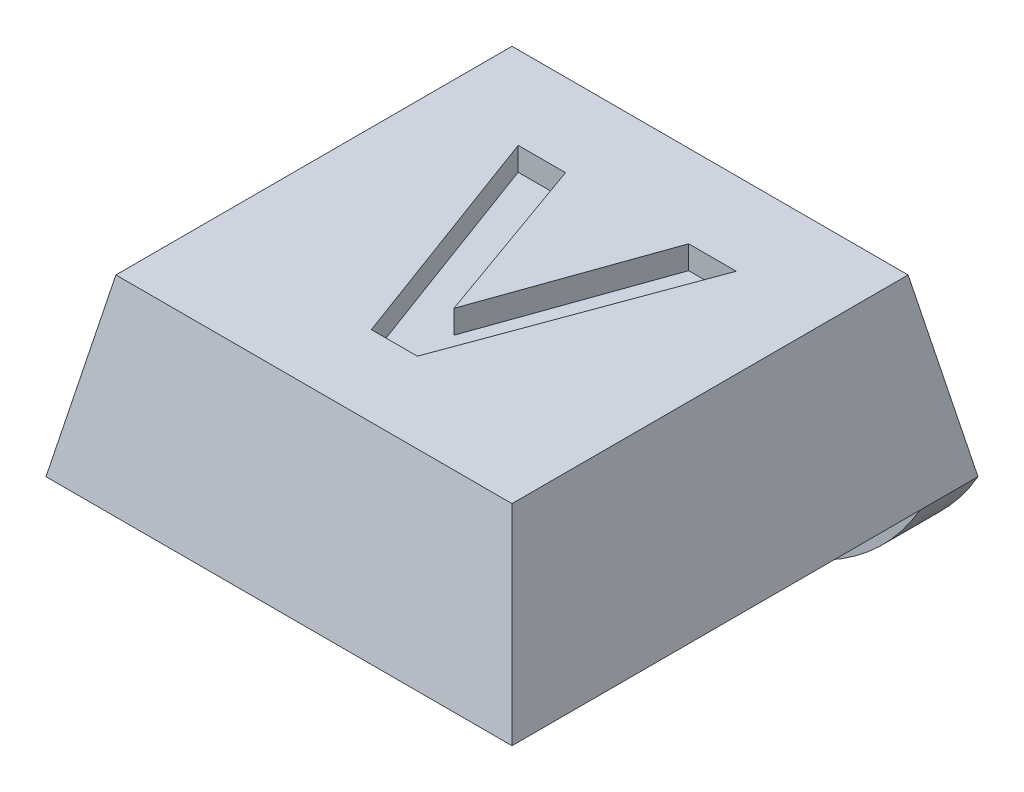
ISO-10303-21;
HEADER;
FILE_DESCRIPTION(('STEP AP214'),'2;1');
FILE_NAME('part.step','',(''),(''),'','','');
FILE_SCHEMA(('AUTOMOTIVE_DESIGN { 1 0 10303 214 1 1 1 1 }'));
ENDSEC;
DATA;
#1=APPLICATION_CONTEXT('core data for automotive mechanical design processes');
#2=APPLICATION_PROTOCOL_DEFINITION('international standard','automotive_design',2000,#1);
#3=PRODUCT_CONTEXT('',#1,'mechanical');
#4=PRODUCT('Part','Part','',(#3));
#5=PRODUCT_RELATED_PRODUCT_CATEGORY('part','',(#4));
#6=PRODUCT_DEFINITION_FORMATION('','',#4);
#7=PRODUCT_DEFINITION_CONTEXT('part definition',#1,'design');
#8=PRODUCT_DEFINITION('design','',#6,#7);
#9=PRODUCT_DEFINITION_SHAPE('','',#8);
#10=(LENGTH_UNIT() NAMED_UNIT(*) SI_UNIT(.MILLI.,.METRE.));
#11=(NAMED_UNIT(*) PLANE_ANGLE_UNIT() SI_UNIT($,.RADIAN.));
#12=(NAMED_UNIT(*) SI_UNIT($,.STERADIAN.) SOLID_ANGLE_UNIT());
#13=UNCERTAINTY_MEASURE_WITH_UNIT(LENGTH_MEASURE(1.E-05),#10,'distance_accuracy_value','');
#14=(GEOMETRIC_REPRESENTATION_CONTEXT(3) GLOBAL_UNCERTAINTY_ASSIGNED_CONTEXT((#13)) GLOBAL_UNIT_ASSIGNED_CONTEXT((#10,
#11,#12)) REPRESENTATION_CONTEXT('',''));
#15=CARTESIAN_POINT('',(0.,0.,0.));
#16=DIRECTION('',(0.,0.,1.));
#17=DIRECTION('',(1.,0.,0.));
#18=AXIS2_PLACEMENT_3D('',#15,#16,#17);
#19=CARTESIAN_POINT('',(0.,3.,0.));
#20=DIRECTION('',(0.,-1.,0.));
#21=DIRECTION('',(0.,0.,-1.));
#22=AXIS2_PLACEMENT_3D('',#19,#20,#21);
#23=PLANE('',#22);
#24=DIRECTION('',(-1.,0.,0.));
#25=VECTOR('',#24,1.);
#26=CARTESIAN_POINT('',(11.,3.,-0.6));
#27=LINE('',#26,#25);
#28=CARTESIAN_POINT('',(7.4,3.,-0.6));
#29=VERTEX_POINT('',#28);
#30=CARTESIAN_POINT('',(0.6,3.,-0.6));
#31=VERTEX_POINT('',#30);
#32=EDGE_CURVE('E199',#29,#31,#27,.T.);
#33=ORIENTED_EDGE('',*,*,#32,.F.);
#34=DIRECTION('',(0.,0.,1.));
#35=VECTOR('',#34,1.);
#36=CARTESIAN_POINT('',(7.4,3.,-8.));
#37=LINE('',#36,#35);
#38=CARTESIAN_POINT('',(7.4,3.,-7.4));
#39=VERTEX_POINT('',#38);
#40=EDGE_CURVE('E212',#39,#29,#37,.T.);
#41=ORIENTED_EDGE('',*,*,#40,.F.);
#42=DIRECTION('',(-1.,0.,0.));
#43=VECTOR('',#42,1.);
#44=CARTESIAN_POINT('',(11.,3.,-7.4));
#45=LINE('',#44,#43);
#46=CARTESIAN_POINT('',(0.599999999999999,3.,-7.4));
#47=VERTEX_POINT('',#46);
#48=EDGE_CURVE('E195',#39,#47,#45,.T.);
#49=ORIENTED_EDGE('',*,*,#48,.T.);
#50=DIRECTION('',(0.,0.,1.));
#51=VECTOR('',#50,1.);
#52=CARTESIAN_POINT('',(0.6,3.,-8.));
#53=LINE('',#52,#51);
#54=EDGE_CURVE('E215',#47,#31,#53,.T.);
#55=ORIENTED_EDGE('',*,*,#54,.T.);
#56=EDGE_LOOP('',(#33,#41,#49,#55));
#57=FACE_BOUND('',#56,.T.);
#58=DIRECTION('',(-1.,0.,0.));
#59=VECTOR('',#58,1.);
#60=CARTESIAN_POINT('',(4.39628987339704,3.,-1.97972373207462));
#61=LINE('',#60,#59);
#62=CARTESIAN_POINT('',(4.39628987339704,3.,-1.97972373207462));
#63=VERTEX_POINT('',#62);
#64=CARTESIAN_POINT('',(3.60542448878166,3.,-1.97972373207462));
#65=VERTEX_POINT('',#64);
#66=EDGE_CURVE('E58',#63,#65,#61,.T.);
#67=ORIENTED_EDGE('',*,*,#66,.T.);
#68=DIRECTION('',(-0.346837004095032,0.,-0.937925419524593));
#69=VECTOR('',#68,1.);
#70=CARTESIAN_POINT('',(3.60542448878166,3.,-1.97972373207462));
#71=LINE('',#70,#69);
#72=CARTESIAN_POINT('',(2.12625782211499,3.,-5.97972373207462));
#73=VERTEX_POINT('',#72);
#74=EDGE_CURVE('E167',#65,#73,#71,.T.);
#75=ORIENTED_EDGE('',*,*,#74,.T.);
#76=DIRECTION('',(1.,0.,0.));
#77=VECTOR('',#76,1.);
#78=CARTESIAN_POINT('',(2.12625782211499,3.,-5.97972373207462));
#79=LINE('',#78,#77);
#80=CARTESIAN_POINT('',(2.93875782211499,3.,-5.97972373207462));
#81=VERTEX_POINT('',#80);
#82=EDGE_CURVE('E561',#73,#81,#79,.T.);
#83=ORIENTED_EDGE('',*,*,#82,.T.);
#84=DIRECTION('',(0.335500275538548,0.,0.942040108017466));
#85=VECTOR('',#84,1.);
#86=CARTESIAN_POINT('',(2.93875782211499,3.,-5.97972373207462));
#87=LINE('',#86,#85);
#88=CARTESIAN_POINT('',(3.99805269390987,3.,-3.00536475771565));
#89=VERTEX_POINT('',#88);
#90=EDGE_CURVE('E542',#81,#89,#87,.T.);
#91=ORIENTED_EDGE('',*,*,#90,.T.);
#92=DIRECTION('',(0.33437347432051,0.,-0.942440650476639));
#93=VECTOR('',#92,1.);
#94=CARTESIAN_POINT('',(3.99805269390987,3.,-3.00536475771565));
#95=LINE('',#94,#93);
#96=CARTESIAN_POINT('',(5.05334115544833,3.,-5.97972373207462));
#97=VERTEX_POINT('',#96);
#98=EDGE_CURVE('E537',#89,#97,#95,.T.);
#99=ORIENTED_EDGE('',*,*,#98,.T.);
#100=DIRECTION('',(1.,0.,0.));
#101=VECTOR('',#100,1.);
#102=CARTESIAN_POINT('',(5.05334115544833,3.,-5.97972373207462));
#103=LINE('',#102,#101);
#104=CARTESIAN_POINT('',(5.86984756570474,3.,-5.97972373207462));
#105=VERTEX_POINT('',#104);
#106=EDGE_CURVE('E531',#97,#105,#103,.T.);
#107=ORIENTED_EDGE('',*,*,#106,.T.);
#108=DIRECTION('',(-0.345679226097517,0.,0.93835274425166));
#109=VECTOR('',#108,1.);
#110=CARTESIAN_POINT('',(5.86984756570474,3.,-5.97972373207462));
#111=LINE('',#110,#109);
#112=EDGE_CURVE('E163',#105,#63,#111,.T.);
#113=ORIENTED_EDGE('',*,*,#112,.T.);
#114=EDGE_LOOP('',(#67,#75,#83,#91,#99,#107,#113));
#115=FACE_BOUND('',#114,.T.);
#116=ADVANCED_FACE('F42',(#57,#115),#23,.F.);
#117=CARTESIAN_POINT('',(8.,0.,-8.));
#118=DIRECTION('',(-0.98058067569092,-0.196116135138184,0.));
#119=DIRECTION('',(0.196116135138184,-0.98058067569092,0.));
#120=AXIS2_PLACEMENT_3D('',#117,#118,#119);
#121=PLANE('',#120);
#122=DIRECTION('',(-0.192450089729875,0.962250448649376,-0.192450089729875));
#123=VECTOR('',#122,1.);
#124=CARTESIAN_POINT('',(7.7037037037037,1.48148148148148,-0.296296296296296));
#125=LINE('',#124,#123);
#126=CARTESIAN_POINT('',(8.,0.,0.));
#127=VERTEX_POINT('',#126);
#128=EDGE_CURVE('E209',#127,#29,#125,.T.);
#129=ORIENTED_EDGE('',*,*,#128,.F.);
#130=DIRECTION('',(0.,0.,-1.));
#131=VECTOR('',#130,1.);
#132=CARTESIAN_POINT('',(8.,0.,0.));
#133=LINE('',#132,#131);
#134=CARTESIAN_POINT('',(8.,0.,-7.));
#135=VERTEX_POINT('',#134);
#136=EDGE_CURVE('E228',#127,#135,#133,.T.);
#137=ORIENTED_EDGE('',*,*,#136,.T.);
#138=DIRECTION('',(0.,0.,1.));
#139=VECTOR('',#138,1.);
#140=CARTESIAN_POINT('',(8.,0.,-8.));
#141=LINE('',#140,#139);
#142=CARTESIAN_POINT('',(8.,0.,-8.));
#143=VERTEX_POINT('',#142);
#144=EDGE_CURVE('E169',#143,#135,#141,.T.);
#145=ORIENTED_EDGE('',*,*,#144,.F.);
#146=DIRECTION('',(0.192450089729875,-0.962250448649376,-0.192450089729875));
#147=VECTOR('',#146,1.);
#148=CARTESIAN_POINT('',(8.,0.,-8.));
#149=LINE('',#148,#147);
#150=EDGE_CURVE('E202',#39,#143,#149,.T.);
#151=ORIENTED_EDGE('',*,*,#150,.F.);
#152=ORIENTED_EDGE('',*,*,#40,.T.);
#153=EDGE_LOOP('',(#129,#137,#145,#151,#152));
#154=FACE_BOUND('',#153,.T.);
#155=ADVANCED_FACE('F296',(#154),#121,.F.);
#156=CARTESIAN_POINT('',(0.,0.,-8.));
#157=DIRECTION('',(0.98058067569092,-0.196116135138184,0.));
#158=DIRECTION('',(0.196116135138184,0.98058067569092,0.));
#159=AXIS2_PLACEMENT_3D('',#156,#157,#158);
#160=PLANE('',#159);
#161=DIRECTION('',(-0.192450089729875,-0.962250448649376,0.192450089729875));
#162=VECTOR('',#161,1.);
#163=CARTESIAN_POINT('',(0.296296296296296,1.48148148148148,-0.296296296296296));
#164=LINE('',#163,#162);
#165=CARTESIAN_POINT('',(0.,0.,0.));
#166=VERTEX_POINT('',#165);
#167=EDGE_CURVE('E256',#31,#166,#164,.T.);
#168=ORIENTED_EDGE('',*,*,#167,.F.);
#169=ORIENTED_EDGE('',*,*,#54,.F.);
#170=DIRECTION('',(0.192450089729875,0.962250448649376,0.192450089729875));
#171=VECTOR('',#170,1.);
#172=CARTESIAN_POINT('',(0.,0.,-8.));
#173=LINE('',#172,#171);
#174=CARTESIAN_POINT('',(0.,0.,-8.));
#175=VERTEX_POINT('',#174);
#176=EDGE_CURVE('E227',#175,#47,#173,.T.);
#177=ORIENTED_EDGE('',*,*,#176,.F.);
#178=DIRECTION('',(0.,0.,1.));
#179=VECTOR('',#178,1.);
#180=CARTESIAN_POINT('',(0.,0.,0.));
#181=LINE('',#180,#179);
#182=CARTESIAN_POINT('',(0.,0.,-7.));
#183=VERTEX_POINT('',#182);
#184=EDGE_CURVE('E232',#175,#183,#181,.T.);
#185=ORIENTED_EDGE('',*,*,#184,.T.);
#186=EDGE_CURVE('E219',#183,#166,#181,.T.);
#187=ORIENTED_EDGE('',*,*,#186,.T.);
#188=EDGE_LOOP('',(#168,#169,#177,#185,#187));
#189=FACE_BOUND('',#188,.T.);
#190=ADVANCED_FACE('F280',(#189),#160,.F.);
#191=CARTESIAN_POINT('',(0.,0.,0.));
#192=DIRECTION('',(0.,-1.,0.));
#193=DIRECTION('',(0.,0.,-1.));
#194=AXIS2_PLACEMENT_3D('',#191,#192,#193);
#195=PLANE('',#194);
#196=DIRECTION('',(-1.,0.,0.));
#197=VECTOR('',#196,1.);
#198=CARTESIAN_POINT('',(0.,0.,-7.));
#199=LINE('',#198,#197);
#200=EDGE_CURVE('E175',#135,#183,#199,.T.);
#201=ORIENTED_EDGE('',*,*,#200,.F.);
#202=ORIENTED_EDGE('',*,*,#136,.F.);
#203=DIRECTION('',(1.,0.,0.));
#204=VECTOR('',#203,1.);
#205=CARTESIAN_POINT('',(0.,0.,0.));
#206=LINE('',#205,#204);
#207=EDGE_CURVE('E229',#166,#127,#206,.T.);
#208=ORIENTED_EDGE('',*,*,#207,.F.);
#209=ORIENTED_EDGE('',*,*,#186,.F.);
#210=EDGE_LOOP('',(#201,#202,#208,#209));
#211=FACE_BOUND('',#210,.T.);
#212=CARTESIAN_POINT('',(4.,0.,-3.75));
#213=DIRECTION('',(0.,-1.,0.));
#214=DIRECTION('',(0.,0.,-1.));
#215=AXIS2_PLACEMENT_3D('',#212,#213,#214);
#216=CIRCLE('',#215,1.8);
#217=CARTESIAN_POINT('',(4.,0.,-5.55));
#218=VERTEX_POINT('',#217);
#219=EDGE_CURVE('E187',#218,#218,#216,.T.);
#220=ORIENTED_EDGE('',*,*,#219,.F.);
#221=EDGE_LOOP('',(#220));
#222=FACE_BOUND('',#221,.T.);
#223=ADVANCED_FACE('F291',(#211,#222),#195,.T.);
#224=CARTESIAN_POINT('',(11.,3.,-7.4));
#225=DIRECTION('',(0.,0.196116135138184,-0.98058067569092));
#226=DIRECTION('',(0.,0.98058067569092,0.196116135138184));
#227=AXIS2_PLACEMENT_3D('',#224,#225,#226);
#228=PLANE('',#227);
#229=ORIENTED_EDGE('',*,*,#150,.T.);
#230=DIRECTION('',(-1.,0.,0.));
#231=VECTOR('',#230,1.);
#232=CARTESIAN_POINT('',(0.,0.,-8.));
#233=LINE('',#232,#231);
#234=EDGE_CURVE('E223',#143,#175,#233,.T.);
#235=ORIENTED_EDGE('',*,*,#234,.T.);
#236=ORIENTED_EDGE('',*,*,#176,.T.);
#237=ORIENTED_EDGE('',*,*,#48,.F.);
#238=EDGE_LOOP('',(#229,#235,#236,#237));
#239=FACE_BOUND('',#238,.T.);
#240=ADVANCED_FACE('F275',(#239),#228,.T.);
#241=CARTESIAN_POINT('',(11.,0.,0.));
#242=DIRECTION('',(0.,0.196116135138184,0.98058067569092));
#243=DIRECTION('',(0.,-0.98058067569092,0.196116135138184));
#244=AXIS2_PLACEMENT_3D('',#241,#242,#243);
#245=PLANE('',#244);
#246=ORIENTED_EDGE('',*,*,#128,.T.);
#247=ORIENTED_EDGE('',*,*,#32,.T.);
#248=ORIENTED_EDGE('',*,*,#167,.T.);
#249=ORIENTED_EDGE('',*,*,#207,.T.);
#250=EDGE_LOOP('',(#246,#247,#248,#249));
#251=FACE_BOUND('',#250,.T.);
#252=ADVANCED_FACE('F322',(#251),#245,.T.);
#253=CARTESIAN_POINT('',(4.,0.8,-3.75));
#254=DIRECTION('',(0.,-1.,0.));
#255=DIRECTION('',(0.,0.,-1.));
#256=AXIS2_PLACEMENT_3D('',#253,#254,#255);
#257=CYLINDRICAL_SURFACE('',#256,1.8);
#258=CARTESIAN_POINT('',(4.,0.8,-3.75));
#259=DIRECTION('',(0.,-1.,0.));
#260=DIRECTION('',(0.,0.,-1.));
#261=AXIS2_PLACEMENT_3D('',#258,#259,#260);
#262=CIRCLE('',#261,1.8);
#263=CARTESIAN_POINT('',(4.,0.8,-5.55));
#264=VERTEX_POINT('',#263);
#265=EDGE_CURVE('E191',#264,#264,#262,.T.);
#266=ORIENTED_EDGE('',*,*,#265,.F.);
#267=EDGE_LOOP('',(#266));
#268=FACE_BOUND('',#267,.T.);
#269=ORIENTED_EDGE('',*,*,#219,.T.);
#270=EDGE_LOOP('',(#269));
#271=FACE_BOUND('',#270,.T.);
#272=ADVANCED_FACE('F329',(#268,#271),#257,.F.);
#273=CARTESIAN_POINT('',(4.,0.8,-3.75));
#274=DIRECTION('',(0.,-1.,0.));
#275=DIRECTION('',(0.,0.,-1.));
#276=AXIS2_PLACEMENT_3D('',#273,#274,#275);
#277=PLANE('',#276);
#278=ORIENTED_EDGE('',*,*,#265,.T.);
#279=EDGE_LOOP('',(#278));
#280=FACE_BOUND('',#279,.T.);
#281=ADVANCED_FACE('F333',(#280),#277,.T.);
#282=CARTESIAN_POINT('',(0.,-2.,-8.));
#283=DIRECTION('',(0.,0.,1.));
#284=DIRECTION('',(1.,0.,0.));
#285=AXIS2_PLACEMENT_3D('',#282,#283,#284);
#286=PLANE('',#285);
#287=ORIENTED_EDGE('',*,*,#234,.F.);
#288=CARTESIAN_POINT('',(4.53589838486225,2.,-8.));
#289=DIRECTION('',(0.,0.,1.));
#290=DIRECTION('',(1.,0.,0.));
#291=AXIS2_PLACEMENT_3D('',#288,#289,#290);
#292=CIRCLE('',#291,4.);
#293=CARTESIAN_POINT('',(4.53589838486225,-2.,-8.));
#294=VERTEX_POINT('',#293);
#295=EDGE_CURVE('E11',#143,#294,#292,.F.);
#296=ORIENTED_EDGE('',*,*,#295,.T.);
#297=DIRECTION('',(1.,0.,0.));
#298=VECTOR('',#297,1.);
#299=CARTESIAN_POINT('',(0.,-2.,-8.));
#300=LINE('',#299,#298);
#301=CARTESIAN_POINT('',(3.46410161513775,-2.,-8.));
#302=VERTEX_POINT('',#301);
#303=EDGE_CURVE('E181',#302,#294,#300,.T.);
#304=ORIENTED_EDGE('',*,*,#303,.F.);
#305=CARTESIAN_POINT('',(3.46410161513775,2.,-8.));
#306=DIRECTION('',(0.,0.,1.));
#307=DIRECTION('',(1.,0.,0.));
#308=AXIS2_PLACEMENT_3D('',#305,#306,#307);
#309=CIRCLE('',#308,4.);
#310=EDGE_CURVE('E51',#302,#175,#309,.F.);
#311=ORIENTED_EDGE('',*,*,#310,.T.);
#312=EDGE_LOOP('',(#287,#296,#304,#311));
#313=FACE_BOUND('',#312,.T.);
#314=ADVANCED_FACE('F268',(#313),#286,.F.);
#315=CARTESIAN_POINT('',(0.,-2.,-7.));
#316=DIRECTION('',(0.,0.,-1.));
#317=DIRECTION('',(-1.,0.,0.));
#318=AXIS2_PLACEMENT_3D('',#315,#316,#317);
#319=PLANE('',#318);
#320=DIRECTION('',(-1.,0.,0.));
#321=VECTOR('',#320,1.);
#322=CARTESIAN_POINT('',(0.,-2.,-7.));
#323=LINE('',#322,#321);
#324=CARTESIAN_POINT('',(4.53589838486225,-2.,-7.));
#325=VERTEX_POINT('',#324);
#326=CARTESIAN_POINT('',(3.46410161513775,-2.,-7.));
#327=VERTEX_POINT('',#326);
#328=EDGE_CURVE('E185',#325,#327,#323,.T.);
#329=ORIENTED_EDGE('',*,*,#328,.F.);
#330=CARTESIAN_POINT('',(4.53589838486225,2.,-7.));
#331=DIRECTION('',(0.,0.,-1.));
#332=DIRECTION('',(-1.,0.,0.));
#333=AXIS2_PLACEMENT_3D('',#330,#331,#332);
#334=CIRCLE('',#333,4.);
#335=EDGE_CURVE('E262',#325,#135,#334,.F.);
#336=ORIENTED_EDGE('',*,*,#335,.T.);
#337=ORIENTED_EDGE('',*,*,#200,.T.);
#338=CARTESIAN_POINT('',(3.46410161513775,2.,-7.));
#339=DIRECTION('',(0.,0.,-1.));
#340=DIRECTION('',(-1.,0.,0.));
#341=AXIS2_PLACEMENT_3D('',#338,#339,#340);
#342=CIRCLE('',#341,4.);
#343=EDGE_CURVE('E66',#183,#327,#342,.F.);
#344=ORIENTED_EDGE('',*,*,#343,.T.);
#345=EDGE_LOOP('',(#329,#336,#337,#344));
#346=FACE_BOUND('',#345,.T.);
#347=ADVANCED_FACE('F286',(#346),#319,.F.);
#348=CARTESIAN_POINT('',(0.,-2.,0.));
#349=DIRECTION('',(0.,1.,0.));
#350=DIRECTION('',(0.,0.,1.));
#351=AXIS2_PLACEMENT_3D('',#348,#349,#350);
#352=PLANE('',#351);
#353=ORIENTED_EDGE('',*,*,#303,.T.);
#354=DIRECTION('',(0.,0.,1.));
#355=VECTOR('',#354,1.);
#356=CARTESIAN_POINT('',(4.53589838486225,-2.,0.));
#357=LINE('',#356,#355);
#358=EDGE_CURVE('E255',#294,#325,#357,.T.);
#359=ORIENTED_EDGE('',*,*,#358,.T.);
#360=ORIENTED_EDGE('',*,*,#328,.T.);
#361=DIRECTION('',(0.,0.,-1.));
#362=VECTOR('',#361,1.);
#363=CARTESIAN_POINT('',(3.46410161513775,-2.,0.));
#364=LINE('',#363,#362);
#365=EDGE_CURVE('E251',#327,#302,#364,.T.);
#366=ORIENTED_EDGE('',*,*,#365,.T.);
#367=EDGE_LOOP('',(#353,#359,#360,#366));
#368=FACE_BOUND('',#367,.T.);
#369=ADVANCED_FACE('F284',(#368),#352,.F.);
#370=CARTESIAN_POINT('',(4.53589838486225,2.,-8.));
#371=DIRECTION('',(0.,0.,1.));
#372=DIRECTION('',(1.,0.,0.));
#373=AXIS2_PLACEMENT_3D('',#370,#371,#372);
#374=CYLINDRICAL_SURFACE('',#373,4.);
#375=ORIENTED_EDGE('',*,*,#295,.F.);
#376=ORIENTED_EDGE('',*,*,#144,.T.);
#377=ORIENTED_EDGE('',*,*,#335,.F.);
#378=ORIENTED_EDGE('',*,*,#358,.F.);
#379=EDGE_LOOP('',(#375,#376,#377,#378));
#380=FACE_BOUND('',#379,.T.);
#381=ADVANCED_FACE('F297',(#380),#374,.T.);
#382=CARTESIAN_POINT('',(3.46410161513775,2.,-8.));
#383=DIRECTION('',(0.,0.,-1.));
#384=DIRECTION('',(-1.,0.,0.));
#385=AXIS2_PLACEMENT_3D('',#382,#383,#384);
#386=CYLINDRICAL_SURFACE('',#385,4.);
#387=ORIENTED_EDGE('',*,*,#343,.F.);
#388=ORIENTED_EDGE('',*,*,#184,.F.);
#389=ORIENTED_EDGE('',*,*,#310,.F.);
#390=ORIENTED_EDGE('',*,*,#365,.F.);
#391=EDGE_LOOP('',(#387,#388,#389,#390));
#392=FACE_BOUND('',#391,.T.);
#393=ADVANCED_FACE('F44',(#392),#386,.T.);
#394=CARTESIAN_POINT('',(4.39628987339704,2.6,-1.97972373207462));
#395=DIRECTION('',(0.,0.,-1.));
#396=DIRECTION('',(-1.,0.,0.));
#397=AXIS2_PLACEMENT_3D('',#394,#395,#396);
#398=PLANE('',#397);
#399=ORIENTED_EDGE('',*,*,#66,.F.);
#400=DIRECTION('',(0.,1.,0.));
#401=VECTOR('',#400,1.);
#402=CARTESIAN_POINT('',(4.39628987339704,2.6,-1.97972373207462));
#403=LINE('',#402,#401);
#404=CARTESIAN_POINT('',(4.39628987339704,2.6,-1.97972373207462));
#405=VERTEX_POINT('',#404);
#406=EDGE_CURVE('E161',#405,#63,#403,.T.);
#407=ORIENTED_EDGE('',*,*,#406,.F.);
#408=DIRECTION('',(-1.,0.,0.));
#409=VECTOR('',#408,1.);
#410=CARTESIAN_POINT('',(4.39628987339704,2.6,-1.97972373207462));
#411=LINE('',#410,#409);
#412=CARTESIAN_POINT('',(3.60542448878166,2.6,-1.97972373207462));
#413=VERTEX_POINT('',#412);
#414=EDGE_CURVE('E151',#405,#413,#411,.T.);
#415=ORIENTED_EDGE('',*,*,#414,.T.);
#416=DIRECTION('',(0.,1.,0.));
#417=VECTOR('',#416,1.);
#418=CARTESIAN_POINT('',(3.60542448878166,2.6,-1.97972373207462));
#419=LINE('',#418,#417);
#420=EDGE_CURVE('E160',#413,#65,#419,.T.);
#421=ORIENTED_EDGE('',*,*,#420,.T.);
#422=EDGE_LOOP('',(#399,#407,#415,#421));
#423=FACE_BOUND('',#422,.T.);
#424=ADVANCED_FACE('F159',(#423),#398,.T.);
#425=CARTESIAN_POINT('',(3.60542448878166,2.6,-1.97972373207462));
#426=DIRECTION('',(0.937925419524593,0.,-0.346837004095032));
#427=DIRECTION('',(-0.346837004095032,0.,-0.937925419524593));
#428=AXIS2_PLACEMENT_3D('',#425,#426,#427);
#429=PLANE('',#428);
#430=ORIENTED_EDGE('',*,*,#74,.F.);
#431=ORIENTED_EDGE('',*,*,#420,.F.);
#432=DIRECTION('',(-0.346837004095032,0.,-0.937925419524593));
#433=VECTOR('',#432,1.);
#434=CARTESIAN_POINT('',(3.60542448878166,2.6,-1.97972373207462));
#435=LINE('',#434,#433);
#436=CARTESIAN_POINT('',(2.12625782211499,2.6,-5.97972373207462));
#437=VERTEX_POINT('',#436);
#438=EDGE_CURVE('E147',#413,#437,#435,.T.);
#439=ORIENTED_EDGE('',*,*,#438,.T.);
#440=DIRECTION('',(0.,1.,0.));
#441=VECTOR('',#440,1.);
#442=CARTESIAN_POINT('',(2.12625782211499,2.6,-5.97972373207462));
#443=LINE('',#442,#441);
#444=EDGE_CURVE('E170',#437,#73,#443,.T.);
#445=ORIENTED_EDGE('',*,*,#444,.T.);
#446=EDGE_LOOP('',(#430,#431,#439,#445));
#447=FACE_BOUND('',#446,.T.);
#448=ADVANCED_FACE('F165',(#447),#429,.T.);
#449=CARTESIAN_POINT('',(2.12625782211499,2.6,-5.97972373207462));
#450=DIRECTION('',(0.,0.,1.));
#451=DIRECTION('',(1.,0.,0.));
#452=AXIS2_PLACEMENT_3D('',#449,#450,#451);
#453=PLANE('',#452);
#454=ORIENTED_EDGE('',*,*,#82,.F.);
#455=ORIENTED_EDGE('',*,*,#444,.F.);
#456=DIRECTION('',(1.,0.,0.));
#457=VECTOR('',#456,1.);
#458=CARTESIAN_POINT('',(2.12625782211499,2.6,-5.97972373207462));
#459=LINE('',#458,#457);
#460=CARTESIAN_POINT('',(2.93875782211499,2.6,-5.97972373207462));
#461=VERTEX_POINT('',#460);
#462=EDGE_CURVE('E153',#437,#461,#459,.T.);
#463=ORIENTED_EDGE('',*,*,#462,.T.);
#464=DIRECTION('',(0.,1.,0.));
#465=VECTOR('',#464,1.);
#466=CARTESIAN_POINT('',(2.93875782211499,2.6,-5.97972373207462));
#467=LINE('',#466,#465);
#468=EDGE_CURVE('E177',#461,#81,#467,.T.);
#469=ORIENTED_EDGE('',*,*,#468,.T.);
#470=EDGE_LOOP('',(#454,#455,#463,#469));
#471=FACE_BOUND('',#470,.T.);
#472=ADVANCED_FACE('F346',(#471),#453,.T.);
#473=CARTESIAN_POINT('',(2.93875782211499,2.6,-5.97972373207462));
#474=DIRECTION('',(-0.942040108017466,0.,0.335500275538548));
#475=DIRECTION('',(0.335500275538548,0.,0.942040108017466));
#476=AXIS2_PLACEMENT_3D('',#473,#474,#475);
#477=PLANE('',#476);
#478=ORIENTED_EDGE('',*,*,#90,.F.);
#479=ORIENTED_EDGE('',*,*,#468,.F.);
#480=DIRECTION('',(0.335500275538548,0.,0.942040108017466));
#481=VECTOR('',#480,1.);
#482=CARTESIAN_POINT('',(2.93875782211499,2.6,-5.97972373207462));
#483=LINE('',#482,#481);
#484=CARTESIAN_POINT('',(3.99805269390987,2.6,-3.00536475771565));
#485=VERTEX_POINT('',#484);
#486=EDGE_CURVE('E579',#461,#485,#483,.T.);
#487=ORIENTED_EDGE('',*,*,#486,.T.);
#488=DIRECTION('',(0.,1.,0.));
#489=VECTOR('',#488,1.);
#490=CARTESIAN_POINT('',(3.99805269390987,2.6,-3.00536475771565));
#491=LINE('',#490,#489);
#492=EDGE_CURVE('E554',#485,#89,#491,.T.);
#493=ORIENTED_EDGE('',*,*,#492,.T.);
#494=EDGE_LOOP('',(#478,#479,#487,#493));
#495=FACE_BOUND('',#494,.T.);
#496=ADVANCED_FACE('F349',(#495),#477,.T.);
#497=CARTESIAN_POINT('',(3.99805269390987,2.6,-3.00536475771565));
#498=DIRECTION('',(0.942440650476639,0.,0.33437347432051));
#499=DIRECTION('',(0.33437347432051,0.,-0.942440650476639));
#500=AXIS2_PLACEMENT_3D('',#497,#498,#499);
#501=PLANE('',#500);
#502=ORIENTED_EDGE('',*,*,#98,.F.);
#503=ORIENTED_EDGE('',*,*,#492,.F.);
#504=DIRECTION('',(0.33437347432051,0.,-0.942440650476639));
#505=VECTOR('',#504,1.);
#506=CARTESIAN_POINT('',(3.99805269390987,2.6,-3.00536475771565));
#507=LINE('',#506,#505);
#508=CARTESIAN_POINT('',(5.05334115544833,2.6,-5.97972373207462));
#509=VERTEX_POINT('',#508);
#510=EDGE_CURVE('E576',#485,#509,#507,.T.);
#511=ORIENTED_EDGE('',*,*,#510,.T.);
#512=DIRECTION('',(0.,1.,0.));
#513=VECTOR('',#512,1.);
#514=CARTESIAN_POINT('',(5.05334115544833,2.6,-5.97972373207462));
#515=LINE('',#514,#513);
#516=EDGE_CURVE('E551',#509,#97,#515,.T.);
#517=ORIENTED_EDGE('',*,*,#516,.T.);
#518=EDGE_LOOP('',(#502,#503,#511,#517));
#519=FACE_BOUND('',#518,.T.);
#520=ADVANCED_FACE('F353',(#519),#501,.T.);
#521=CARTESIAN_POINT('',(5.05334115544833,2.6,-5.97972373207462));
#522=DIRECTION('',(0.,0.,1.));
#523=DIRECTION('',(1.,0.,0.));
#524=AXIS2_PLACEMENT_3D('',#521,#522,#523);
#525=PLANE('',#524);
#526=ORIENTED_EDGE('',*,*,#106,.F.);
#527=ORIENTED_EDGE('',*,*,#516,.F.);
#528=DIRECTION('',(1.,0.,0.));
#529=VECTOR('',#528,1.);
#530=CARTESIAN_POINT('',(5.05334115544833,2.6,-5.97972373207462));
#531=LINE('',#530,#529);
#532=CARTESIAN_POINT('',(5.86984756570474,2.6,-5.97972373207462));
#533=VERTEX_POINT('',#532);
#534=EDGE_CURVE('E573',#509,#533,#531,.T.);
#535=ORIENTED_EDGE('',*,*,#534,.T.);
#536=DIRECTION('',(0.,1.,0.));
#537=VECTOR('',#536,1.);
#538=CARTESIAN_POINT('',(5.86984756570474,2.6,-5.97972373207462));
#539=LINE('',#538,#537);
#540=EDGE_CURVE('E529',#533,#105,#539,.T.);
#541=ORIENTED_EDGE('',*,*,#540,.T.);
#542=EDGE_LOOP('',(#526,#527,#535,#541));
#543=FACE_BOUND('',#542,.T.);
#544=ADVANCED_FACE('F357',(#543),#525,.T.);
#545=CARTESIAN_POINT('',(5.86984756570474,2.6,-5.97972373207462));
#546=DIRECTION('',(-0.93835274425166,0.,-0.345679226097517));
#547=DIRECTION('',(-0.345679226097517,0.,0.93835274425166));
#548=AXIS2_PLACEMENT_3D('',#545,#546,#547);
#549=PLANE('',#548);
#550=ORIENTED_EDGE('',*,*,#112,.F.);
#551=ORIENTED_EDGE('',*,*,#540,.F.);
#552=DIRECTION('',(-0.345679226097517,0.,0.93835274425166));
#553=VECTOR('',#552,1.);
#554=CARTESIAN_POINT('',(5.86984756570474,2.6,-5.97972373207462));
#555=LINE('',#554,#553);
#556=EDGE_CURVE('E548',#533,#405,#555,.T.);
#557=ORIENTED_EDGE('',*,*,#556,.T.);
#558=ORIENTED_EDGE('',*,*,#406,.T.);
#559=EDGE_LOOP('',(#550,#551,#557,#558));
#560=FACE_BOUND('',#559,.T.);
#561=ADVANCED_FACE('F361',(#560),#549,.T.);
#562=CARTESIAN_POINT('',(0.,2.6,0.));
#563=DIRECTION('',(0.,-1.,0.));
#564=DIRECTION('',(0.,0.,-1.));
#565=AXIS2_PLACEMENT_3D('',#562,#563,#564);
#566=PLANE('',#565);
#567=ORIENTED_EDGE('',*,*,#414,.F.);
#568=ORIENTED_EDGE('',*,*,#556,.F.);
#569=ORIENTED_EDGE('',*,*,#534,.F.);
#570=ORIENTED_EDGE('',*,*,#510,.F.);
#571=ORIENTED_EDGE('',*,*,#486,.F.);
#572=ORIENTED_EDGE('',*,*,#462,.F.);
#573=ORIENTED_EDGE('',*,*,#438,.F.);
#574=EDGE_LOOP('',(#567,#568,#569,#570,#571,#572,#573));
#575=FACE_BOUND('',#574,.T.);
#576=ADVANCED_FACE('F149',(#575),#566,.F.);
#577=CLOSED_SHELL('',(#116,#155,#190,#223,#240,#252,#272,#281,#314,#347,#369,#381,#393,#424,
#448,#472,#496,#520,#544,#561,#576));
#578=MANIFOLD_SOLID_BREP('B2',#577);
#579=ADVANCED_BREP_SHAPE_REPRESENTATION('',(#18,#578),#14);
#580=SHAPE_DEFINITION_REPRESENTATION(#9,#579);
ENDSEC;
END-ISO-10303-21;
